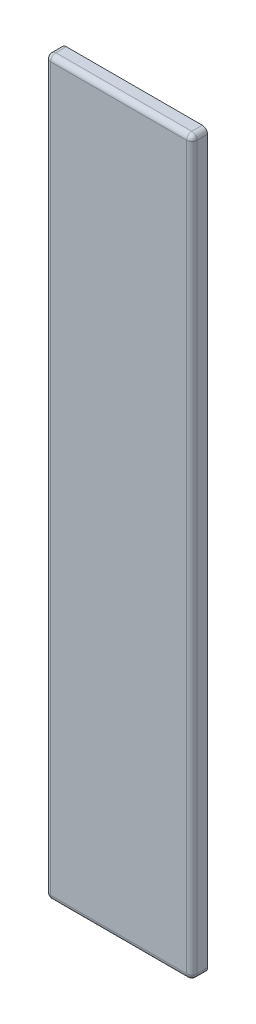
ISO-10303-21;
HEADER;
FILE_DESCRIPTION(('STEP AP214'),'2;1');
FILE_NAME('part.step','',(''),(''),'','','');
FILE_SCHEMA(('AUTOMOTIVE_DESIGN { 1 0 10303 214 1 1 1 1 }'));
ENDSEC;
DATA;
#1=APPLICATION_CONTEXT('core data for automotive mechanical design processes');
#2=APPLICATION_PROTOCOL_DEFINITION('international standard','automotive_design',2000,#1);
#3=PRODUCT_CONTEXT('',#1,'mechanical');
#4=PRODUCT('Part','Part','',(#3));
#5=PRODUCT_RELATED_PRODUCT_CATEGORY('part','',(#4));
#6=PRODUCT_DEFINITION_FORMATION('','',#4);
#7=PRODUCT_DEFINITION_CONTEXT('part definition',#1,'design');
#8=PRODUCT_DEFINITION('design','',#6,#7);
#9=PRODUCT_DEFINITION_SHAPE('','',#8);
#10=(LENGTH_UNIT() NAMED_UNIT(*) SI_UNIT(.MILLI.,.METRE.));
#11=(NAMED_UNIT(*) PLANE_ANGLE_UNIT() SI_UNIT($,.RADIAN.));
#12=(NAMED_UNIT(*) SI_UNIT($,.STERADIAN.) SOLID_ANGLE_UNIT());
#13=UNCERTAINTY_MEASURE_WITH_UNIT(LENGTH_MEASURE(1.E-05),#10,'distance_accuracy_value','');
#14=(GEOMETRIC_REPRESENTATION_CONTEXT(3) GLOBAL_UNCERTAINTY_ASSIGNED_CONTEXT((#13)) GLOBAL_UNIT_ASSIGNED_CONTEXT((#10,
#11,#12)) REPRESENTATION_CONTEXT('',''));
#15=CARTESIAN_POINT('',(0.,0.,0.));
#16=DIRECTION('',(0.,0.,1.));
#17=DIRECTION('',(1.,0.,0.));
#18=AXIS2_PLACEMENT_3D('',#15,#16,#17);
#19=CARTESIAN_POINT('',(355.,720.,218.769145366412));
#20=DIRECTION('',(0.,0.,-1.));
#21=DIRECTION('',(-1.,0.,0.));
#22=AXIS2_PLACEMENT_3D('',#19,#20,#21);
#23=CYLINDRICAL_SURFACE('',#22,5.);
#24=DIRECTION('',(0.,0.,-1.));
#25=VECTOR('',#24,1.);
#26=CARTESIAN_POINT('',(350.,720.,218.769145366412));
#27=LINE('',#26,#25);
#28=CARTESIAN_POINT('',(350.,720.,213.769145366412));
#29=VERTEX_POINT('',#28);
#30=CARTESIAN_POINT('',(350.,720.,203.769145366412));
#31=VERTEX_POINT('',#30);
#32=EDGE_CURVE('E116',#29,#31,#27,.T.);
#33=ORIENTED_EDGE('',*,*,#32,.F.);
#34=CARTESIAN_POINT('',(355.,720.,213.769145366412));
#35=DIRECTION('',(0.,0.,-1.));
#36=DIRECTION('',(-1.,0.,0.));
#37=AXIS2_PLACEMENT_3D('',#34,#35,#36);
#38=CIRCLE('',#37,5.);
#39=CARTESIAN_POINT('',(355.,725.,213.769145366412));
#40=VERTEX_POINT('',#39);
#41=EDGE_CURVE('E11',#29,#40,#38,.T.);
#42=ORIENTED_EDGE('',*,*,#41,.T.);
#43=DIRECTION('',(0.,0.,-1.));
#44=VECTOR('',#43,1.);
#45=CARTESIAN_POINT('',(355.,725.,218.769145366412));
#46=LINE('',#45,#44);
#47=CARTESIAN_POINT('',(355.,725.,203.769145366412));
#48=VERTEX_POINT('',#47);
#49=EDGE_CURVE('E137',#40,#48,#46,.T.);
#50=ORIENTED_EDGE('',*,*,#49,.T.);
#51=CARTESIAN_POINT('',(355.,720.,203.769145366412));
#52=DIRECTION('',(0.,0.,1.));
#53=DIRECTION('',(1.,0.,0.));
#54=AXIS2_PLACEMENT_3D('',#51,#52,#53);
#55=CIRCLE('',#54,5.);
#56=EDGE_CURVE('E131',#48,#31,#55,.T.);
#57=ORIENTED_EDGE('',*,*,#56,.T.);
#58=EDGE_LOOP('',(#33,#42,#50,#57));
#59=FACE_BOUND('',#58,.T.);
#60=ADVANCED_FACE('F40',(#59),#23,.T.);
#61=CARTESIAN_POINT('',(350.,720.,218.769145366412));
#62=DIRECTION('',(1.,0.,0.));
#63=DIRECTION('',(0.,1.,0.));
#64=AXIS2_PLACEMENT_3D('',#61,#62,#63);
#65=PLANE('',#64);
#66=DIRECTION('',(0.,0.,-1.));
#67=VECTOR('',#66,1.);
#68=CARTESIAN_POINT('',(350.,30.0000000000002,218.769145366412));
#69=LINE('',#68,#67);
#70=CARTESIAN_POINT('',(350.,30.0000000000002,213.769145366412));
#71=VERTEX_POINT('',#70);
#72=CARTESIAN_POINT('',(350.,30.0000000000002,203.769145366412));
#73=VERTEX_POINT('',#72);
#74=EDGE_CURVE('E125',#71,#73,#69,.T.);
#75=ORIENTED_EDGE('',*,*,#74,.F.);
#76=DIRECTION('',(0.,-1.,0.));
#77=VECTOR('',#76,1.);
#78=CARTESIAN_POINT('',(350.,720.,213.769145366412));
#79=LINE('',#78,#77);
#80=EDGE_CURVE('E49',#71,#29,#79,.F.);
#81=ORIENTED_EDGE('',*,*,#80,.T.);
#82=ORIENTED_EDGE('',*,*,#32,.T.);
#83=DIRECTION('',(0.,-1.,0.));
#84=VECTOR('',#83,1.);
#85=CARTESIAN_POINT('',(350.,720.,203.769145366412));
#86=LINE('',#85,#84);
#87=EDGE_CURVE('E119',#31,#73,#86,.T.);
#88=ORIENTED_EDGE('',*,*,#87,.T.);
#89=EDGE_LOOP('',(#75,#81,#82,#88));
#90=FACE_BOUND('',#89,.T.);
#91=ADVANCED_FACE('F118',(#90),#65,.F.);
#92=CARTESIAN_POINT('',(355.,30.0000000000002,218.769145366412));
#93=DIRECTION('',(0.,0.,-1.));
#94=DIRECTION('',(-1.,0.,0.));
#95=AXIS2_PLACEMENT_3D('',#92,#93,#94);
#96=CYLINDRICAL_SURFACE('',#95,5.);
#97=DIRECTION('',(0.,0.,-1.));
#98=VECTOR('',#97,1.);
#99=CARTESIAN_POINT('',(355.,25.0000000000002,218.769145366412));
#100=LINE('',#99,#98);
#101=CARTESIAN_POINT('',(355.,25.0000000000002,213.769145366412));
#102=VERTEX_POINT('',#101);
#103=CARTESIAN_POINT('',(355.,25.0000000000002,203.769145366412));
#104=VERTEX_POINT('',#103);
#105=EDGE_CURVE('E167',#102,#104,#100,.T.);
#106=ORIENTED_EDGE('',*,*,#105,.F.);
#107=CARTESIAN_POINT('',(355.,30.0000000000002,213.769145366412));
#108=DIRECTION('',(0.,0.,-1.));
#109=DIRECTION('',(-1.,0.,0.));
#110=AXIS2_PLACEMENT_3D('',#107,#108,#109);
#111=CIRCLE('',#110,5.);
#112=EDGE_CURVE('E64',#102,#71,#111,.T.);
#113=ORIENTED_EDGE('',*,*,#112,.T.);
#114=ORIENTED_EDGE('',*,*,#74,.T.);
#115=CARTESIAN_POINT('',(355.,30.0000000000002,203.769145366412));
#116=DIRECTION('',(0.,0.,1.));
#117=DIRECTION('',(1.,0.,0.));
#118=AXIS2_PLACEMENT_3D('',#115,#116,#117);
#119=CIRCLE('',#118,5.);
#120=EDGE_CURVE('E134',#73,#104,#119,.T.);
#121=ORIENTED_EDGE('',*,*,#120,.T.);
#122=EDGE_LOOP('',(#106,#113,#114,#121));
#123=FACE_BOUND('',#122,.T.);
#124=ADVANCED_FACE('F271',(#123),#96,.T.);
#125=CARTESIAN_POINT('',(355.,25.0000000000002,218.769145366412));
#126=DIRECTION('',(0.,1.,0.));
#127=DIRECTION('',(0.,0.,1.));
#128=AXIS2_PLACEMENT_3D('',#125,#126,#127);
#129=PLANE('',#128);
#130=DIRECTION('',(0.,0.,-1.));
#131=VECTOR('',#130,1.);
#132=CARTESIAN_POINT('',(485.000000000006,25.0000000000002,218.769145366412));
#133=LINE('',#132,#131);
#134=CARTESIAN_POINT('',(485.000000000006,25.0000000000002,213.769145366412));
#135=VERTEX_POINT('',#134);
#136=CARTESIAN_POINT('',(485.000000000006,25.0000000000002,203.769145366412));
#137=VERTEX_POINT('',#136);
#138=EDGE_CURVE('E165',#135,#137,#133,.T.);
#139=ORIENTED_EDGE('',*,*,#138,.F.);
#140=DIRECTION('',(1.,0.,0.));
#141=VECTOR('',#140,1.);
#142=CARTESIAN_POINT('',(355.,25.0000000000002,213.769145366412));
#143=LINE('',#142,#141);
#144=EDGE_CURVE('E187',#135,#102,#143,.F.);
#145=ORIENTED_EDGE('',*,*,#144,.T.);
#146=ORIENTED_EDGE('',*,*,#105,.T.);
#147=DIRECTION('',(1.,0.,0.));
#148=VECTOR('',#147,1.);
#149=CARTESIAN_POINT('',(355.,25.0000000000002,203.769145366412));
#150=LINE('',#149,#148);
#151=EDGE_CURVE('E144',#104,#137,#150,.T.);
#152=ORIENTED_EDGE('',*,*,#151,.T.);
#153=EDGE_LOOP('',(#139,#145,#146,#152));
#154=FACE_BOUND('',#153,.T.);
#155=ADVANCED_FACE('F254',(#154),#129,.F.);
#156=CARTESIAN_POINT('',(485.000000000006,30.0000000000002,218.769145366412));
#157=DIRECTION('',(0.,0.,-1.));
#158=DIRECTION('',(-1.,0.,0.));
#159=AXIS2_PLACEMENT_3D('',#156,#157,#158);
#160=CYLINDRICAL_SURFACE('',#159,5.);
#161=DIRECTION('',(0.,0.,-1.));
#162=VECTOR('',#161,1.);
#163=CARTESIAN_POINT('',(490.000000000006,30.0000000000002,218.769145366412));
#164=LINE('',#163,#162);
#165=CARTESIAN_POINT('',(490.000000000006,30.0000000000002,213.769145366412));
#166=VERTEX_POINT('',#165);
#167=CARTESIAN_POINT('',(490.000000000006,30.0000000000002,203.769145366412));
#168=VERTEX_POINT('',#167);
#169=EDGE_CURVE('E163',#166,#168,#164,.T.);
#170=ORIENTED_EDGE('',*,*,#169,.F.);
#171=CARTESIAN_POINT('',(485.000000000006,30.0000000000002,213.769145366412));
#172=DIRECTION('',(0.,0.,-1.));
#173=DIRECTION('',(-1.,0.,0.));
#174=AXIS2_PLACEMENT_3D('',#171,#172,#173);
#175=CIRCLE('',#174,5.);
#176=EDGE_CURVE('E185',#166,#135,#175,.T.);
#177=ORIENTED_EDGE('',*,*,#176,.T.);
#178=ORIENTED_EDGE('',*,*,#138,.T.);
#179=CARTESIAN_POINT('',(485.000000000006,30.0000000000002,203.769145366412));
#180=DIRECTION('',(0.,0.,1.));
#181=DIRECTION('',(1.,0.,0.));
#182=AXIS2_PLACEMENT_3D('',#179,#180,#181);
#183=CIRCLE('',#182,5.);
#184=EDGE_CURVE('E147',#137,#168,#183,.T.);
#185=ORIENTED_EDGE('',*,*,#184,.T.);
#186=EDGE_LOOP('',(#170,#177,#178,#185));
#187=FACE_BOUND('',#186,.T.);
#188=ADVANCED_FACE('F252',(#187),#160,.T.);
#189=CARTESIAN_POINT('',(490.000000000006,30.0000000000002,218.769145366412));
#190=DIRECTION('',(-1.,0.,0.));
#191=DIRECTION('',(0.,0.,1.));
#192=AXIS2_PLACEMENT_3D('',#189,#190,#191);
#193=PLANE('',#192);
#194=DIRECTION('',(0.,0.,-1.));
#195=VECTOR('',#194,1.);
#196=CARTESIAN_POINT('',(490.000000000006,720.,218.769145366412));
#197=LINE('',#196,#195);
#198=CARTESIAN_POINT('',(490.000000000006,720.,213.769145366412));
#199=VERTEX_POINT('',#198);
#200=CARTESIAN_POINT('',(490.000000000006,720.,203.769145366412));
#201=VERTEX_POINT('',#200);
#202=EDGE_CURVE('E161',#199,#201,#197,.T.);
#203=ORIENTED_EDGE('',*,*,#202,.F.);
#204=DIRECTION('',(0.,1.,0.));
#205=VECTOR('',#204,1.);
#206=CARTESIAN_POINT('',(490.000000000006,30.0000000000002,213.769145366412));
#207=LINE('',#206,#205);
#208=EDGE_CURVE('E183',#199,#166,#207,.F.);
#209=ORIENTED_EDGE('',*,*,#208,.T.);
#210=ORIENTED_EDGE('',*,*,#169,.T.);
#211=DIRECTION('',(0.,1.,0.));
#212=VECTOR('',#211,1.);
#213=CARTESIAN_POINT('',(490.000000000006,30.0000000000002,203.769145366412));
#214=LINE('',#213,#212);
#215=EDGE_CURVE('E150',#168,#201,#214,.T.);
#216=ORIENTED_EDGE('',*,*,#215,.T.);
#217=EDGE_LOOP('',(#203,#209,#210,#216));
#218=FACE_BOUND('',#217,.T.);
#219=ADVANCED_FACE('F238',(#218),#193,.F.);
#220=CARTESIAN_POINT('',(485.000000000006,720.,218.769145366412));
#221=DIRECTION('',(0.,0.,-1.));
#222=DIRECTION('',(-1.,0.,0.));
#223=AXIS2_PLACEMENT_3D('',#220,#221,#222);
#224=CYLINDRICAL_SURFACE('',#223,5.);
#225=DIRECTION('',(0.,0.,-1.));
#226=VECTOR('',#225,1.);
#227=CARTESIAN_POINT('',(485.000000000006,725.,218.769145366412));
#228=LINE('',#227,#226);
#229=CARTESIAN_POINT('',(485.000000000006,725.,213.769145366412));
#230=VERTEX_POINT('',#229);
#231=CARTESIAN_POINT('',(485.000000000006,725.,203.769145366412));
#232=VERTEX_POINT('',#231);
#233=EDGE_CURVE('E159',#230,#232,#228,.T.);
#234=ORIENTED_EDGE('',*,*,#233,.F.);
#235=CARTESIAN_POINT('',(485.000000000006,720.,213.769145366412));
#236=DIRECTION('',(0.,0.,-1.));
#237=DIRECTION('',(-1.,0.,0.));
#238=AXIS2_PLACEMENT_3D('',#235,#236,#237);
#239=CIRCLE('',#238,5.);
#240=EDGE_CURVE('E181',#230,#199,#239,.T.);
#241=ORIENTED_EDGE('',*,*,#240,.T.);
#242=ORIENTED_EDGE('',*,*,#202,.T.);
#243=CARTESIAN_POINT('',(485.000000000006,720.,203.769145366412));
#244=DIRECTION('',(0.,0.,1.));
#245=DIRECTION('',(1.,0.,0.));
#246=AXIS2_PLACEMENT_3D('',#243,#244,#245);
#247=CIRCLE('',#246,5.);
#248=EDGE_CURVE('E153',#201,#232,#247,.T.);
#249=ORIENTED_EDGE('',*,*,#248,.T.);
#250=EDGE_LOOP('',(#234,#241,#242,#249));
#251=FACE_BOUND('',#250,.T.);
#252=ADVANCED_FACE('F235',(#251),#224,.T.);
#253=CARTESIAN_POINT('',(485.000000000006,725.,218.769145366412));
#254=DIRECTION('',(0.,-1.,0.));
#255=DIRECTION('',(0.,0.,-1.));
#256=AXIS2_PLACEMENT_3D('',#253,#254,#255);
#257=PLANE('',#256);
#258=ORIENTED_EDGE('',*,*,#49,.F.);
#259=DIRECTION('',(-1.,0.,0.));
#260=VECTOR('',#259,1.);
#261=CARTESIAN_POINT('',(485.000000000006,725.,213.769145366412));
#262=LINE('',#261,#260);
#263=EDGE_CURVE('E178',#40,#230,#262,.F.);
#264=ORIENTED_EDGE('',*,*,#263,.T.);
#265=ORIENTED_EDGE('',*,*,#233,.T.);
#266=DIRECTION('',(-1.,0.,0.));
#267=VECTOR('',#266,1.);
#268=CARTESIAN_POINT('',(485.000000000006,725.,203.769145366412));
#269=LINE('',#268,#267);
#270=EDGE_CURVE('E156',#232,#48,#269,.T.);
#271=ORIENTED_EDGE('',*,*,#270,.T.);
#272=EDGE_LOOP('',(#258,#264,#265,#271));
#273=FACE_BOUND('',#272,.T.);
#274=ADVANCED_FACE('F223',(#273),#257,.F.);
#275=CARTESIAN_POINT('',(355.,720.,218.769145366412));
#276=DIRECTION('',(0.,0.,1.));
#277=DIRECTION('',(1.,0.,0.));
#278=AXIS2_PLACEMENT_3D('',#275,#276,#277);
#279=PLANE('',#278);
#280=DIRECTION('',(0.,1.,0.));
#281=VECTOR('',#280,1.);
#282=CARTESIAN_POINT('',(485.000000000006,720.,218.769145366412));
#283=LINE('',#282,#281);
#284=CARTESIAN_POINT('',(485.000000000006,30.0000000000002,218.769145366412));
#285=VERTEX_POINT('',#284);
#286=CARTESIAN_POINT('',(485.000000000006,720.,218.769145366412));
#287=VERTEX_POINT('',#286);
#288=EDGE_CURVE('E173',#285,#287,#283,.T.);
#289=ORIENTED_EDGE('',*,*,#288,.T.);
#290=DIRECTION('',(-1.,0.,0.));
#291=VECTOR('',#290,1.);
#292=CARTESIAN_POINT('',(355.,720.,218.769145366412));
#293=LINE('',#292,#291);
#294=CARTESIAN_POINT('',(355.,720.,218.769145366412));
#295=VERTEX_POINT('',#294);
#296=EDGE_CURVE('E175',#287,#295,#293,.T.);
#297=ORIENTED_EDGE('',*,*,#296,.T.);
#298=DIRECTION('',(0.,-1.,0.));
#299=VECTOR('',#298,1.);
#300=CARTESIAN_POINT('',(355.,30.0000000000002,218.769145366412));
#301=LINE('',#300,#299);
#302=CARTESIAN_POINT('',(355.,30.0000000000002,218.769145366412));
#303=VERTEX_POINT('',#302);
#304=EDGE_CURVE('E124',#295,#303,#301,.T.);
#305=ORIENTED_EDGE('',*,*,#304,.T.);
#306=DIRECTION('',(1.,0.,0.));
#307=VECTOR('',#306,1.);
#308=CARTESIAN_POINT('',(485.000000000006,30.0000000000002,218.769145366412));
#309=LINE('',#308,#307);
#310=EDGE_CURVE('E171',#303,#285,#309,.T.);
#311=ORIENTED_EDGE('',*,*,#310,.T.);
#312=EDGE_LOOP('',(#289,#297,#305,#311));
#313=FACE_BOUND('',#312,.T.);
#314=ADVANCED_FACE('F257',(#313),#279,.T.);
#315=CARTESIAN_POINT('',(355.,720.,203.769145366412));
#316=DIRECTION('',(0.,0.,1.));
#317=DIRECTION('',(1.,0.,0.));
#318=AXIS2_PLACEMENT_3D('',#315,#316,#317);
#319=PLANE('',#318);
#320=ORIENTED_EDGE('',*,*,#56,.F.);
#321=ORIENTED_EDGE('',*,*,#270,.F.);
#322=ORIENTED_EDGE('',*,*,#248,.F.);
#323=ORIENTED_EDGE('',*,*,#215,.F.);
#324=ORIENTED_EDGE('',*,*,#184,.F.);
#325=ORIENTED_EDGE('',*,*,#151,.F.);
#326=ORIENTED_EDGE('',*,*,#120,.F.);
#327=ORIENTED_EDGE('',*,*,#87,.F.);
#328=EDGE_LOOP('',(#320,#321,#322,#323,#324,#325,#326,#327));
#329=FACE_BOUND('',#328,.T.);
#330=ADVANCED_FACE('F129',(#329),#319,.F.);
#331=CARTESIAN_POINT('',(355.,30.0000000000002,213.769145366412));
#332=DIRECTION('',(-1.,0.,0.));
#333=DIRECTION('',(0.,0.,1.));
#334=AXIS2_PLACEMENT_3D('',#331,#332,#333);
#335=CYLINDRICAL_SURFACE('',#334,5.);
#336=CARTESIAN_POINT('',(355.,30.0000000000002,213.769145366412));
#337=DIRECTION('',(-1.,0.,0.));
#338=DIRECTION('',(0.,0.,1.));
#339=AXIS2_PLACEMENT_3D('',#336,#337,#338);
#340=CIRCLE('',#339,5.);
#341=EDGE_CURVE('E141',#102,#303,#340,.T.);
#342=ORIENTED_EDGE('',*,*,#341,.F.);
#343=ORIENTED_EDGE('',*,*,#144,.F.);
#344=CARTESIAN_POINT('',(485.000000000006,30.0000000000002,213.769145366412));
#345=DIRECTION('',(1.,0.,0.));
#346=DIRECTION('',(0.,0.,-1.));
#347=AXIS2_PLACEMENT_3D('',#344,#345,#346);
#348=CIRCLE('',#347,5.);
#349=EDGE_CURVE('E44',#285,#135,#348,.T.);
#350=ORIENTED_EDGE('',*,*,#349,.F.);
#351=ORIENTED_EDGE('',*,*,#310,.F.);
#352=EDGE_LOOP('',(#342,#343,#350,#351));
#353=FACE_BOUND('',#352,.T.);
#354=ADVANCED_FACE('F42',(#353),#335,.T.);
#355=CARTESIAN_POINT('',(485.000000000006,30.0000000000002,213.769145366412));
#356=DIRECTION('',(0.,0.,1.));
#357=DIRECTION('',(1.,0.,0.));
#358=AXIS2_PLACEMENT_3D('',#355,#356,#357);
#359=SPHERICAL_SURFACE('',#358,5.);
#360=ORIENTED_EDGE('',*,*,#349,.T.);
#361=ORIENTED_EDGE('',*,*,#176,.F.);
#362=CARTESIAN_POINT('',(485.000000000006,30.0000000000002,213.769145366412));
#363=DIRECTION('',(0.,1.,0.));
#364=DIRECTION('',(0.,0.,1.));
#365=AXIS2_PLACEMENT_3D('',#362,#363,#364);
#366=CIRCLE('',#365,5.);
#367=EDGE_CURVE('E204',#285,#166,#366,.T.);
#368=ORIENTED_EDGE('',*,*,#367,.F.);
#369=EDGE_LOOP('',(#360,#361,#368));
#370=FACE_BOUND('',#369,.T.);
#371=ADVANCED_FACE('F248',(#370),#359,.T.);
#372=CARTESIAN_POINT('',(355.,30.0000000000002,213.769145366412));
#373=DIRECTION('',(0.,0.,1.));
#374=DIRECTION('',(1.,0.,0.));
#375=AXIS2_PLACEMENT_3D('',#372,#373,#374);
#376=SPHERICAL_SURFACE('',#375,5.);
#377=ORIENTED_EDGE('',*,*,#112,.F.);
#378=ORIENTED_EDGE('',*,*,#341,.T.);
#379=CARTESIAN_POINT('',(355.,30.0000000000002,213.769145366412));
#380=DIRECTION('',(0.,1.,0.));
#381=DIRECTION('',(-1.,0.,0.));
#382=AXIS2_PLACEMENT_3D('',#379,#380,#381);
#383=CIRCLE('',#382,5.);
#384=EDGE_CURVE('E201',#71,#303,#383,.T.);
#385=ORIENTED_EDGE('',*,*,#384,.F.);
#386=EDGE_LOOP('',(#377,#378,#385));
#387=FACE_BOUND('',#386,.T.);
#388=ADVANCED_FACE('F210',(#387),#376,.T.);
#389=CARTESIAN_POINT('',(485.000000000006,720.,213.769145366412));
#390=DIRECTION('',(0.,-1.,0.));
#391=DIRECTION('',(0.,0.,-1.));
#392=AXIS2_PLACEMENT_3D('',#389,#390,#391);
#393=CYLINDRICAL_SURFACE('',#392,5.);
#394=ORIENTED_EDGE('',*,*,#367,.T.);
#395=ORIENTED_EDGE('',*,*,#208,.F.);
#396=CARTESIAN_POINT('',(485.000000000006,720.,213.769145366412));
#397=DIRECTION('',(0.,1.,0.));
#398=DIRECTION('',(0.,0.,1.));
#399=AXIS2_PLACEMENT_3D('',#396,#397,#398);
#400=CIRCLE('',#399,5.);
#401=EDGE_CURVE('E198',#287,#199,#400,.T.);
#402=ORIENTED_EDGE('',*,*,#401,.F.);
#403=ORIENTED_EDGE('',*,*,#288,.F.);
#404=EDGE_LOOP('',(#394,#395,#402,#403));
#405=FACE_BOUND('',#404,.T.);
#406=ADVANCED_FACE('F243',(#405),#393,.T.);
#407=CARTESIAN_POINT('',(355.,720.,213.769145366412));
#408=DIRECTION('',(0.,1.,0.));
#409=DIRECTION('',(-1.,0.,0.));
#410=AXIS2_PLACEMENT_3D('',#407,#408,#409);
#411=CYLINDRICAL_SURFACE('',#410,5.);
#412=ORIENTED_EDGE('',*,*,#384,.T.);
#413=ORIENTED_EDGE('',*,*,#304,.F.);
#414=CARTESIAN_POINT('',(355.,720.,213.769145366412));
#415=DIRECTION('',(0.,1.,0.));
#416=DIRECTION('',(0.,0.,1.));
#417=AXIS2_PLACEMENT_3D('',#414,#415,#416);
#418=CIRCLE('',#417,5.);
#419=EDGE_CURVE('E195',#29,#295,#418,.T.);
#420=ORIENTED_EDGE('',*,*,#419,.F.);
#421=ORIENTED_EDGE('',*,*,#80,.F.);
#422=EDGE_LOOP('',(#412,#413,#420,#421));
#423=FACE_BOUND('',#422,.T.);
#424=ADVANCED_FACE('F216',(#423),#411,.T.);
#425=CARTESIAN_POINT('',(485.000000000006,720.,213.769145366412));
#426=DIRECTION('',(0.,0.,1.));
#427=DIRECTION('',(1.,0.,0.));
#428=AXIS2_PLACEMENT_3D('',#425,#426,#427);
#429=SPHERICAL_SURFACE('',#428,5.);
#430=ORIENTED_EDGE('',*,*,#401,.T.);
#431=ORIENTED_EDGE('',*,*,#240,.F.);
#432=CARTESIAN_POINT('',(485.000000000006,720.,213.769145366412));
#433=DIRECTION('',(-1.,0.,0.));
#434=DIRECTION('',(0.,0.,1.));
#435=AXIS2_PLACEMENT_3D('',#432,#433,#434);
#436=CIRCLE('',#435,5.);
#437=EDGE_CURVE('E193',#287,#230,#436,.T.);
#438=ORIENTED_EDGE('',*,*,#437,.F.);
#439=EDGE_LOOP('',(#430,#431,#438));
#440=FACE_BOUND('',#439,.T.);
#441=ADVANCED_FACE('F231',(#440),#429,.T.);
#442=CARTESIAN_POINT('',(355.,720.,213.769145366412));
#443=DIRECTION('',(0.,0.,1.));
#444=DIRECTION('',(1.,0.,0.));
#445=AXIS2_PLACEMENT_3D('',#442,#443,#444);
#446=SPHERICAL_SURFACE('',#445,5.);
#447=ORIENTED_EDGE('',*,*,#41,.F.);
#448=ORIENTED_EDGE('',*,*,#419,.T.);
#449=CARTESIAN_POINT('',(355.,720.,213.769145366412));
#450=DIRECTION('',(1.,0.,0.));
#451=DIRECTION('',(0.,0.,-1.));
#452=AXIS2_PLACEMENT_3D('',#449,#450,#451);
#453=CIRCLE('',#452,5.);
#454=EDGE_CURVE('E191',#40,#295,#453,.T.);
#455=ORIENTED_EDGE('',*,*,#454,.F.);
#456=EDGE_LOOP('',(#447,#448,#455));
#457=FACE_BOUND('',#456,.T.);
#458=ADVANCED_FACE('F220',(#457),#446,.T.);
#459=CARTESIAN_POINT('',(355.,720.,213.769145366412));
#460=DIRECTION('',(1.,0.,0.));
#461=DIRECTION('',(0.,0.,-1.));
#462=AXIS2_PLACEMENT_3D('',#459,#460,#461);
#463=CYLINDRICAL_SURFACE('',#462,5.);
#464=ORIENTED_EDGE('',*,*,#437,.T.);
#465=ORIENTED_EDGE('',*,*,#263,.F.);
#466=ORIENTED_EDGE('',*,*,#454,.T.);
#467=ORIENTED_EDGE('',*,*,#296,.F.);
#468=EDGE_LOOP('',(#464,#465,#466,#467));
#469=FACE_BOUND('',#468,.T.);
#470=ADVANCED_FACE('F226',(#469),#463,.T.);
#471=CLOSED_SHELL('',(#60,#91,#124,#155,#188,#219,#252,#274,#314,#330,#354,#371,#388,#406,#424,
#441,#458,#470));
#472=MANIFOLD_SOLID_BREP('B2',#471);
#473=ADVANCED_BREP_SHAPE_REPRESENTATION('',(#18,#472),#14);
#474=SHAPE_DEFINITION_REPRESENTATION(#9,#473);
ENDSEC;
END-ISO-10303-21;
